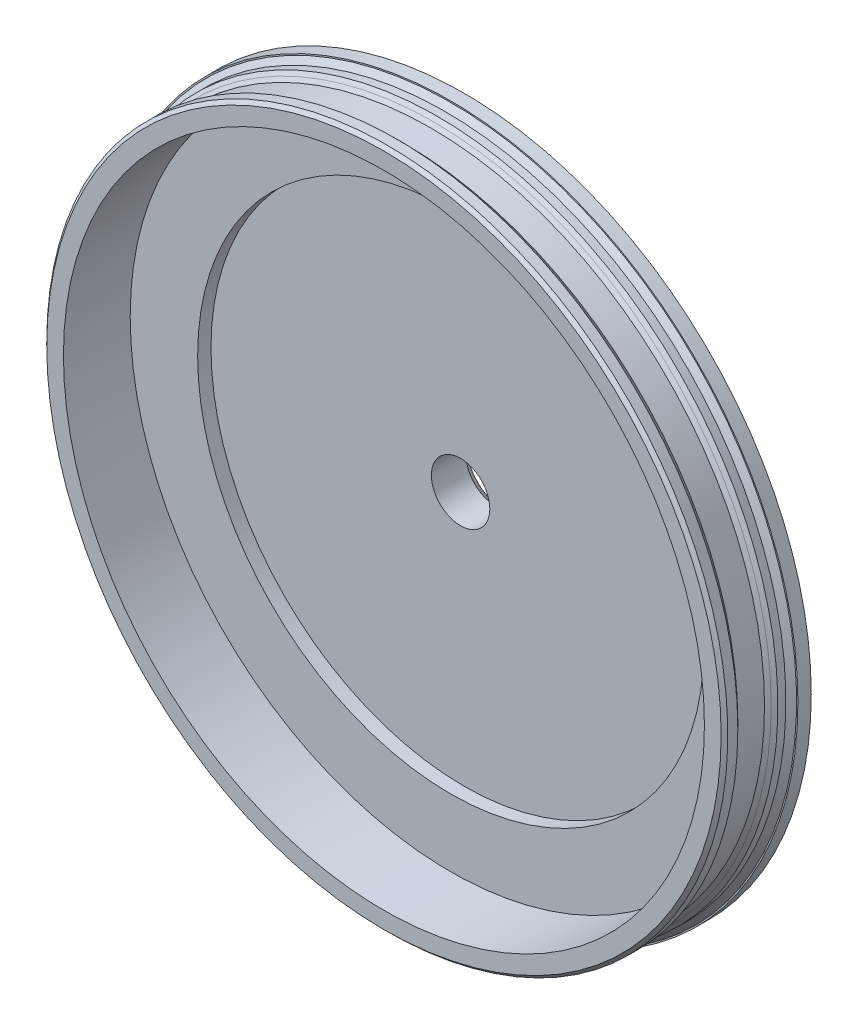
ISO-10303-21;
HEADER;
FILE_DESCRIPTION(('STEP AP214'),'2;1');
FILE_NAME('part.step','',(''),(''),'','','');
FILE_SCHEMA(('AUTOMOTIVE_DESIGN { 1 0 10303 214 1 1 1 1 }'));
ENDSEC;
DATA;
#1=APPLICATION_CONTEXT('core data for automotive mechanical design processes');
#2=APPLICATION_PROTOCOL_DEFINITION('international standard','automotive_design',2000,#1);
#3=PRODUCT_CONTEXT('',#1,'mechanical');
#4=PRODUCT('Part','Part','',(#3));
#5=PRODUCT_RELATED_PRODUCT_CATEGORY('part','',(#4));
#6=PRODUCT_DEFINITION_FORMATION('','',#4);
#7=PRODUCT_DEFINITION_CONTEXT('part definition',#1,'design');
#8=PRODUCT_DEFINITION('design','',#6,#7);
#9=PRODUCT_DEFINITION_SHAPE('','',#8);
#10=(LENGTH_UNIT() NAMED_UNIT(*) SI_UNIT(.MILLI.,.METRE.));
#11=(NAMED_UNIT(*) PLANE_ANGLE_UNIT() SI_UNIT($,.RADIAN.));
#12=(NAMED_UNIT(*) SI_UNIT($,.STERADIAN.) SOLID_ANGLE_UNIT());
#13=UNCERTAINTY_MEASURE_WITH_UNIT(LENGTH_MEASURE(1.E-05),#10,'distance_accuracy_value','');
#14=(GEOMETRIC_REPRESENTATION_CONTEXT(3) GLOBAL_UNCERTAINTY_ASSIGNED_CONTEXT((#13)) GLOBAL_UNIT_ASSIGNED_CONTEXT((#10,
#11,#12)) REPRESENTATION_CONTEXT('',''));
#15=CARTESIAN_POINT('',(0.,0.,0.));
#16=DIRECTION('',(0.,0.,1.));
#17=DIRECTION('',(1.,0.,0.));
#18=AXIS2_PLACEMENT_3D('',#15,#16,#17);
#19=CARTESIAN_POINT('',(0.,0.,-73.9813673678491));
#20=DIRECTION('',(0.,0.,-1.));
#21=DIRECTION('',(-1.,0.,0.));
#22=AXIS2_PLACEMENT_3D('',#19,#20,#21);
#23=CYLINDRICAL_SURFACE('',#22,37.9);
#24=CARTESIAN_POINT('',(0.,0.,8.7));
#25=DIRECTION('',(0.,0.,-1.));
#26=DIRECTION('',(-1.,0.,0.));
#27=AXIS2_PLACEMENT_3D('',#24,#25,#26);
#28=CIRCLE('',#27,37.9);
#29=CARTESIAN_POINT('',(-37.9,0.,8.7));
#30=VERTEX_POINT('',#29);
#31=EDGE_CURVE('E85',#30,#30,#28,.T.);
#32=ORIENTED_EDGE('',*,*,#31,.F.);
#33=EDGE_LOOP('',(#32));
#34=FACE_BOUND('',#33,.T.);
#35=CARTESIAN_POINT('',(0.,0.,6.7));
#36=DIRECTION('',(0.,0.,-1.));
#37=DIRECTION('',(-1.,0.,0.));
#38=AXIS2_PLACEMENT_3D('',#35,#36,#37);
#39=CIRCLE('',#38,37.9);
#40=CARTESIAN_POINT('',(-37.9,0.,6.7));
#41=VERTEX_POINT('',#40);
#42=EDGE_CURVE('E44',#41,#41,#39,.F.);
#43=ORIENTED_EDGE('',*,*,#42,.F.);
#44=EDGE_LOOP('',(#43));
#45=FACE_BOUND('',#44,.T.);
#46=ADVANCED_FACE('F33',(#34,#45),#23,.F.);
#47=CARTESIAN_POINT('',(37.9,0.,8.7));
#48=DIRECTION('',(0.,0.,-1.));
#49=DIRECTION('',(-1.,0.,0.));
#50=AXIS2_PLACEMENT_3D('',#47,#48,#49);
#51=PLANE('',#50);
#52=CARTESIAN_POINT('',(0.,0.,8.7));
#53=DIRECTION('',(0.,0.,-1.));
#54=DIRECTION('',(-1.,0.,0.));
#55=AXIS2_PLACEMENT_3D('',#52,#53,#54);
#56=CIRCLE('',#55,48.);
#57=CARTESIAN_POINT('',(-48.,0.,8.7));
#58=VERTEX_POINT('',#57);
#59=EDGE_CURVE('E88',#58,#58,#56,.T.);
#60=ORIENTED_EDGE('',*,*,#59,.F.);
#61=EDGE_LOOP('',(#60));
#62=FACE_BOUND('',#61,.T.);
#63=ORIENTED_EDGE('',*,*,#31,.T.);
#64=EDGE_LOOP('',(#63));
#65=FACE_BOUND('',#64,.T.);
#66=ADVANCED_FACE('F122',(#62,#65),#51,.F.);
#67=CARTESIAN_POINT('',(0.,0.,-73.9813673678491));
#68=DIRECTION('',(0.,0.,-1.));
#69=DIRECTION('',(-1.,0.,0.));
#70=AXIS2_PLACEMENT_3D('',#67,#68,#69);
#71=CYLINDRICAL_SURFACE('',#70,48.);
#72=CARTESIAN_POINT('',(0.,0.,18.7));
#73=DIRECTION('',(0.,0.,-1.));
#74=DIRECTION('',(-1.,0.,0.));
#75=AXIS2_PLACEMENT_3D('',#72,#73,#74);
#76=CIRCLE('',#75,48.);
#77=CARTESIAN_POINT('',(-48.,0.,18.7));
#78=VERTEX_POINT('',#77);
#79=EDGE_CURVE('E91',#78,#78,#76,.T.);
#80=ORIENTED_EDGE('',*,*,#79,.F.);
#81=EDGE_LOOP('',(#80));
#82=FACE_BOUND('',#81,.T.);
#83=ORIENTED_EDGE('',*,*,#59,.T.);
#84=EDGE_LOOP('',(#83));
#85=FACE_BOUND('',#84,.T.);
#86=ADVANCED_FACE('F130',(#82,#85),#71,.F.);
#87=CARTESIAN_POINT('',(48.,0.,18.7));
#88=DIRECTION('',(0.,0.,-1.));
#89=DIRECTION('',(-1.,0.,0.));
#90=AXIS2_PLACEMENT_3D('',#87,#88,#89);
#91=PLANE('',#90);
#92=CARTESIAN_POINT('',(0.,0.,18.7));
#93=DIRECTION('',(0.,0.,-1.));
#94=DIRECTION('',(-1.,0.,0.));
#95=AXIS2_PLACEMENT_3D('',#92,#93,#94);
#96=CIRCLE('',#95,50.5);
#97=CARTESIAN_POINT('',(-50.5,0.,18.7));
#98=VERTEX_POINT('',#97);
#99=EDGE_CURVE('E76',#98,#98,#96,.F.);
#100=ORIENTED_EDGE('',*,*,#99,.T.);
#101=EDGE_LOOP('',(#100));
#102=FACE_BOUND('',#101,.T.);
#103=ORIENTED_EDGE('',*,*,#79,.T.);
#104=EDGE_LOOP('',(#103));
#105=FACE_BOUND('',#104,.T.);
#106=ADVANCED_FACE('F195',(#102,#105),#91,.F.);
#107=CARTESIAN_POINT('',(0.,0.,-73.9813673678491));
#108=DIRECTION('',(0.,0.,-1.));
#109=DIRECTION('',(-1.,0.,0.));
#110=AXIS2_PLACEMENT_3D('',#107,#108,#109);
#111=CYLINDRICAL_SURFACE('',#110,51.);
#112=CARTESIAN_POINT('',(0.,0.,18.2));
#113=DIRECTION('',(0.,0.,-1.));
#114=DIRECTION('',(-1.,0.,0.));
#115=AXIS2_PLACEMENT_3D('',#112,#113,#114);
#116=CIRCLE('',#115,51.);
#117=CARTESIAN_POINT('',(-51.,0.,18.2));
#118=VERTEX_POINT('',#117);
#119=EDGE_CURVE('E79',#118,#118,#116,.T.);
#120=ORIENTED_EDGE('',*,*,#119,.T.);
#121=EDGE_LOOP('',(#120));
#122=FACE_BOUND('',#121,.T.);
#123=CARTESIAN_POINT('',(0.,0.,16.7));
#124=DIRECTION('',(0.,0.,1.));
#125=DIRECTION('',(1.,0.,0.));
#126=AXIS2_PLACEMENT_3D('',#123,#124,#125);
#127=CIRCLE('',#126,51.);
#128=CARTESIAN_POINT('',(51.,0.,16.7));
#129=VERTEX_POINT('',#128);
#130=EDGE_CURVE('E82',#129,#129,#127,.T.);
#131=ORIENTED_EDGE('',*,*,#130,.T.);
#132=EDGE_LOOP('',(#131));
#133=FACE_BOUND('',#132,.T.);
#134=ADVANCED_FACE('F191',(#122,#133),#111,.T.);
#135=CARTESIAN_POINT('',(0.,0.,-73.9813673678491));
#136=DIRECTION('',(0.,0.,-1.));
#137=DIRECTION('',(-1.,0.,0.));
#138=AXIS2_PLACEMENT_3D('',#135,#136,#137);
#139=CYLINDRICAL_SURFACE('',#138,50.);
#140=CARTESIAN_POINT('',(0.,0.,11.7));
#141=DIRECTION('',(0.,0.,-1.));
#142=DIRECTION('',(-1.,0.,0.));
#143=AXIS2_PLACEMENT_3D('',#140,#141,#142);
#144=CIRCLE('',#143,50.);
#145=CARTESIAN_POINT('',(-50.,0.,11.7));
#146=VERTEX_POINT('',#145);
#147=EDGE_CURVE('E59',#146,#146,#144,.F.);
#148=ORIENTED_EDGE('',*,*,#147,.T.);
#149=EDGE_LOOP('',(#148));
#150=FACE_BOUND('',#149,.T.);
#151=CARTESIAN_POINT('',(0.,0.,15.7));
#152=DIRECTION('',(0.,0.,1.));
#153=DIRECTION('',(1.,0.,0.));
#154=AXIS2_PLACEMENT_3D('',#151,#152,#153);
#155=CIRCLE('',#154,50.);
#156=CARTESIAN_POINT('',(50.,0.,15.7));
#157=VERTEX_POINT('',#156);
#158=EDGE_CURVE('E70',#157,#157,#155,.F.);
#159=ORIENTED_EDGE('',*,*,#158,.T.);
#160=EDGE_LOOP('',(#159));
#161=FACE_BOUND('',#160,.T.);
#162=ADVANCED_FACE('F187',(#150,#161),#139,.T.);
#163=CARTESIAN_POINT('',(0.,0.,-73.9813673678491));
#164=DIRECTION('',(0.,0.,-1.));
#165=DIRECTION('',(-1.,0.,0.));
#166=AXIS2_PLACEMENT_3D('',#163,#164,#165);
#167=CYLINDRICAL_SURFACE('',#166,51.);
#168=CARTESIAN_POINT('',(0.,0.,9.49999999999998));
#169=DIRECTION('',(0.,0.,-1.));
#170=DIRECTION('',(-1.,0.,0.));
#171=AXIS2_PLACEMENT_3D('',#168,#169,#170);
#172=CIRCLE('',#171,51.);
#173=CARTESIAN_POINT('',(-51.,0.,9.49999999999998));
#174=VERTEX_POINT('',#173);
#175=EDGE_CURVE('E53',#174,#174,#172,.F.);
#176=ORIENTED_EDGE('',*,*,#175,.T.);
#177=EDGE_LOOP('',(#176));
#178=FACE_BOUND('',#177,.T.);
#179=CARTESIAN_POINT('',(0.,0.,10.7));
#180=DIRECTION('',(0.,0.,-1.));
#181=DIRECTION('',(-1.,0.,0.));
#182=AXIS2_PLACEMENT_3D('',#179,#180,#181);
#183=CIRCLE('',#182,51.);
#184=CARTESIAN_POINT('',(-51.,0.,10.7));
#185=VERTEX_POINT('',#184);
#186=EDGE_CURVE('E73',#185,#185,#183,.T.);
#187=ORIENTED_EDGE('',*,*,#186,.T.);
#188=EDGE_LOOP('',(#187));
#189=FACE_BOUND('',#188,.T.);
#190=ADVANCED_FACE('F172',(#178,#189),#167,.T.);
#191=CARTESIAN_POINT('',(51.,0.,8.7));
#192=DIRECTION('',(0.,0.,-1.));
#193=DIRECTION('',(-1.,0.,0.));
#194=AXIS2_PLACEMENT_3D('',#191,#192,#193);
#195=PLANE('',#194);
#196=CARTESIAN_POINT('',(0.,0.,8.7));
#197=DIRECTION('',(0.,0.,-1.));
#198=DIRECTION('',(-1.,0.,0.));
#199=AXIS2_PLACEMENT_3D('',#196,#197,#198);
#200=CIRCLE('',#199,51.8);
#201=CARTESIAN_POINT('',(-51.8,0.,8.7));
#202=VERTEX_POINT('',#201);
#203=EDGE_CURVE('E56',#202,#202,#200,.T.);
#204=ORIENTED_EDGE('',*,*,#203,.T.);
#205=EDGE_LOOP('',(#204));
#206=FACE_BOUND('',#205,.T.);
#207=CARTESIAN_POINT('',(0.,0.,8.7));
#208=DIRECTION('',(0.,0.,-1.));
#209=DIRECTION('',(-1.,0.,0.));
#210=AXIS2_PLACEMENT_3D('',#207,#208,#209);
#211=CIRCLE('',#210,52.);
#212=CARTESIAN_POINT('',(-52.,0.,8.7));
#213=VERTEX_POINT('',#212);
#214=EDGE_CURVE('E94',#213,#213,#211,.T.);
#215=ORIENTED_EDGE('',*,*,#214,.F.);
#216=EDGE_LOOP('',(#215));
#217=FACE_BOUND('',#216,.T.);
#218=ADVANCED_FACE('F168',(#206,#217),#195,.F.);
#219=CARTESIAN_POINT('',(0.,0.,-73.9813673678491));
#220=DIRECTION('',(0.,0.,-1.));
#221=DIRECTION('',(-1.,0.,0.));
#222=AXIS2_PLACEMENT_3D('',#219,#220,#221);
#223=CYLINDRICAL_SURFACE('',#222,52.);
#224=CARTESIAN_POINT('',(0.,0.,6.7));
#225=DIRECTION('',(0.,0.,-1.));
#226=DIRECTION('',(-1.,0.,0.));
#227=AXIS2_PLACEMENT_3D('',#224,#225,#226);
#228=CIRCLE('',#227,52.);
#229=CARTESIAN_POINT('',(-52.,0.,6.7));
#230=VERTEX_POINT('',#229);
#231=EDGE_CURVE('E67',#230,#230,#228,.T.);
#232=ORIENTED_EDGE('',*,*,#231,.F.);
#233=EDGE_LOOP('',(#232));
#234=FACE_BOUND('',#233,.T.);
#235=ORIENTED_EDGE('',*,*,#214,.T.);
#236=EDGE_LOOP('',(#235));
#237=FACE_BOUND('',#236,.T.);
#238=ADVANCED_FACE('F171',(#234,#237),#223,.T.);
#239=CARTESIAN_POINT('',(52.,0.,6.7));
#240=DIRECTION('',(0.,0.,1.));
#241=DIRECTION('',(1.,0.,0.));
#242=AXIS2_PLACEMENT_3D('',#239,#240,#241);
#243=PLANE('',#242);
#244=CARTESIAN_POINT('',(-0.518258265273894,0.,6.7));
#245=DIRECTION('',(0.,0.,1.));
#246=DIRECTION('',(1.,0.,0.));
#247=AXIS2_PLACEMENT_3D('',#244,#245,#246);
#248=CIRCLE('',#247,40.4182582652739);
#249=CARTESIAN_POINT('',(39.9,0.,6.7));
#250=VERTEX_POINT('',#249);
#251=EDGE_CURVE('E48',#250,#250,#248,.F.);
#252=ORIENTED_EDGE('',*,*,#251,.F.);
#253=EDGE_LOOP('',(#252));
#254=FACE_BOUND('',#253,.T.);
#255=ORIENTED_EDGE('',*,*,#231,.T.);
#256=EDGE_LOOP('',(#255));
#257=FACE_BOUND('',#256,.T.);
#258=ADVANCED_FACE('F141',(#254,#257),#243,.F.);
#259=CARTESIAN_POINT('',(0.,0.,18.2));
#260=DIRECTION('',(0.,0.,-1.));
#261=DIRECTION('',(-1.,0.,0.));
#262=AXIS2_PLACEMENT_3D('',#259,#260,#261);
#263=CONICAL_SURFACE('',#262,51.,0.785398163397469);
#264=ORIENTED_EDGE('',*,*,#99,.F.);
#265=EDGE_LOOP('',(#264));
#266=FACE_BOUND('',#265,.T.);
#267=ORIENTED_EDGE('',*,*,#119,.F.);
#268=EDGE_LOOP('',(#267));
#269=FACE_BOUND('',#268,.T.);
#270=ADVANCED_FACE('F137',(#266,#269),#263,.T.);
#271=CARTESIAN_POINT('',(0.,0.,11.2));
#272=DIRECTION('',(0.,0.,-1.));
#273=DIRECTION('',(-1.,0.,0.));
#274=AXIS2_PLACEMENT_3D('',#271,#272,#273);
#275=CONICAL_SURFACE('',#274,50.5,0.785398163397448);
#276=ORIENTED_EDGE('',*,*,#147,.F.);
#277=EDGE_LOOP('',(#276));
#278=FACE_BOUND('',#277,.T.);
#279=CARTESIAN_POINT('',(0.,0.,11.2));
#280=DIRECTION('',(0.,0.,-1.));
#281=DIRECTION('',(-1.,0.,0.));
#282=AXIS2_PLACEMENT_3D('',#279,#280,#281);
#283=CIRCLE('',#282,50.5);
#284=CARTESIAN_POINT('',(-50.5,0.,11.2));
#285=VERTEX_POINT('',#284);
#286=EDGE_CURVE('E63',#285,#285,#283,.T.);
#287=ORIENTED_EDGE('',*,*,#286,.F.);
#288=EDGE_LOOP('',(#287));
#289=FACE_BOUND('',#288,.T.);
#290=ADVANCED_FACE('F140',(#278,#289),#275,.T.);
#291=CARTESIAN_POINT('',(0.,0.,10.7));
#292=DIRECTION('',(0.,0.,-1.));
#293=DIRECTION('',(-1.,0.,0.));
#294=AXIS2_PLACEMENT_3D('',#291,#292,#293);
#295=CONICAL_SURFACE('',#294,51.,0.785398163397455);
#296=ORIENTED_EDGE('',*,*,#286,.T.);
#297=EDGE_LOOP('',(#296));
#298=FACE_BOUND('',#297,.T.);
#299=ORIENTED_EDGE('',*,*,#186,.F.);
#300=EDGE_LOOP('',(#299));
#301=FACE_BOUND('',#300,.T.);
#302=ADVANCED_FACE('F143',(#298,#301),#295,.T.);
#303=CARTESIAN_POINT('',(0.,0.,16.2));
#304=DIRECTION('',(0.,0.,1.));
#305=DIRECTION('',(1.,0.,0.));
#306=AXIS2_PLACEMENT_3D('',#303,#304,#305);
#307=CONICAL_SURFACE('',#306,50.5,0.785398163397428);
#308=ORIENTED_EDGE('',*,*,#130,.F.);
#309=EDGE_LOOP('',(#308));
#310=FACE_BOUND('',#309,.T.);
#311=CARTESIAN_POINT('',(0.,0.,16.2));
#312=DIRECTION('',(0.,0.,1.));
#313=DIRECTION('',(1.,0.,0.));
#314=AXIS2_PLACEMENT_3D('',#311,#312,#313);
#315=CIRCLE('',#314,50.5);
#316=CARTESIAN_POINT('',(50.5,0.,16.2));
#317=VERTEX_POINT('',#316);
#318=EDGE_CURVE('E60',#317,#317,#315,.F.);
#319=ORIENTED_EDGE('',*,*,#318,.F.);
#320=EDGE_LOOP('',(#319));
#321=FACE_BOUND('',#320,.T.);
#322=ADVANCED_FACE('F146',(#310,#321),#307,.T.);
#323=CARTESIAN_POINT('',(0.,0.,15.7));
#324=DIRECTION('',(0.,0.,1.));
#325=DIRECTION('',(1.,0.,0.));
#326=AXIS2_PLACEMENT_3D('',#323,#324,#325);
#327=CONICAL_SURFACE('',#326,50.,0.785398163397448);
#328=ORIENTED_EDGE('',*,*,#318,.T.);
#329=EDGE_LOOP('',(#328));
#330=FACE_BOUND('',#329,.T.);
#331=ORIENTED_EDGE('',*,*,#158,.F.);
#332=EDGE_LOOP('',(#331));
#333=FACE_BOUND('',#332,.T.);
#334=ADVANCED_FACE('F151',(#330,#333),#327,.T.);
#335=CARTESIAN_POINT('',(0.,0.,8.7));
#336=DIRECTION('',(0.,0.,-1.));
#337=DIRECTION('',(-1.,0.,0.));
#338=AXIS2_PLACEMENT_3D('',#335,#336,#337);
#339=CONICAL_SURFACE('',#338,51.8,0.785398163397453);
#340=ORIENTED_EDGE('',*,*,#175,.F.);
#341=EDGE_LOOP('',(#340));
#342=FACE_BOUND('',#341,.T.);
#343=ORIENTED_EDGE('',*,*,#203,.F.);
#344=EDGE_LOOP('',(#343));
#345=FACE_BOUND('',#344,.T.);
#346=ADVANCED_FACE('F154',(#342,#345),#339,.T.);
#347=CARTESIAN_POINT('',(-0.518258265273894,0.,-114.320098012498));
#348=DIRECTION('',(0.,0.,1.));
#349=DIRECTION('',(1.,0.,0.));
#350=AXIS2_PLACEMENT_3D('',#347,#348,#349);
#351=CYLINDRICAL_SURFACE('',#350,40.4182582652739);
#352=ORIENTED_EDGE('',*,*,#251,.T.);
#353=EDGE_LOOP('',(#352));
#354=FACE_BOUND('',#353,.T.);
#355=CARTESIAN_POINT('',(-0.518258265273894,0.,0.));
#356=DIRECTION('',(0.,0.,1.));
#357=DIRECTION('',(1.,0.,0.));
#358=AXIS2_PLACEMENT_3D('',#355,#356,#357);
#359=CIRCLE('',#358,40.4182582652739);
#360=CARTESIAN_POINT('',(39.9,0.,0.));
#361=VERTEX_POINT('',#360);
#362=EDGE_CURVE('E64',#361,#361,#359,.T.);
#363=ORIENTED_EDGE('',*,*,#362,.T.);
#364=EDGE_LOOP('',(#363));
#365=FACE_BOUND('',#364,.T.);
#366=ADVANCED_FACE('F116',(#354,#365),#351,.T.);
#367=CARTESIAN_POINT('',(-0.518258265273894,0.,6.7));
#368=DIRECTION('',(0.,0.,-1.));
#369=DIRECTION('',(-1.,0.,0.));
#370=AXIS2_PLACEMENT_3D('',#367,#368,#369);
#371=PLANE('',#370);
#372=ORIENTED_EDGE('',*,*,#42,.T.);
#373=EDGE_LOOP('',(#372));
#374=FACE_BOUND('',#373,.T.);
#375=CARTESIAN_POINT('',(-0.518258265273894,0.,6.7));
#376=DIRECTION('',(0.,0.,-1.));
#377=DIRECTION('',(-1.,0.,0.));
#378=AXIS2_PLACEMENT_3D('',#375,#376,#377);
#379=CIRCLE('',#378,4.375);
#380=CARTESIAN_POINT('',(-4.89325826527389,0.,6.7));
#381=VERTEX_POINT('',#380);
#382=EDGE_CURVE('E101',#381,#381,#379,.T.);
#383=ORIENTED_EDGE('',*,*,#382,.T.);
#384=EDGE_LOOP('',(#383));
#385=FACE_BOUND('',#384,.T.);
#386=ADVANCED_FACE('F105',(#374,#385),#371,.F.);
#387=CARTESIAN_POINT('',(-0.518258265273894,0.,-114.320098012498));
#388=DIRECTION('',(0.,0.,1.));
#389=DIRECTION('',(1.,0.,0.));
#390=AXIS2_PLACEMENT_3D('',#387,#388,#389);
#391=CYLINDRICAL_SURFACE('',#390,4.375);
#392=CARTESIAN_POINT('',(-0.518258265273894,0.,1.5));
#393=DIRECTION('',(0.,0.,1.));
#394=DIRECTION('',(1.,0.,0.));
#395=AXIS2_PLACEMENT_3D('',#392,#393,#394);
#396=CIRCLE('',#395,4.375);
#397=CARTESIAN_POINT('',(3.85674173472611,0.,1.5));
#398=VERTEX_POINT('',#397);
#399=EDGE_CURVE('E10',#398,#398,#396,.F.);
#400=ORIENTED_EDGE('',*,*,#399,.T.);
#401=EDGE_LOOP('',(#400));
#402=FACE_BOUND('',#401,.T.);
#403=ORIENTED_EDGE('',*,*,#382,.F.);
#404=EDGE_LOOP('',(#403));
#405=FACE_BOUND('',#404,.T.);
#406=ADVANCED_FACE('F107',(#402,#405),#391,.F.);
#407=CARTESIAN_POINT('',(39.9,0.,0.));
#408=DIRECTION('',(0.,0.,1.));
#409=DIRECTION('',(1.,0.,0.));
#410=AXIS2_PLACEMENT_3D('',#407,#408,#409);
#411=PLANE('',#410);
#412=CARTESIAN_POINT('',(-0.518258265273894,0.,0.));
#413=DIRECTION('',(0.,0.,1.));
#414=DIRECTION('',(1.,0.,0.));
#415=AXIS2_PLACEMENT_3D('',#412,#413,#414);
#416=CIRCLE('',#415,5.87500000000001);
#417=CARTESIAN_POINT('',(5.35674173472611,0.,0.));
#418=VERTEX_POINT('',#417);
#419=EDGE_CURVE('E40',#418,#418,#416,.T.);
#420=ORIENTED_EDGE('',*,*,#419,.T.);
#421=EDGE_LOOP('',(#420));
#422=FACE_BOUND('',#421,.T.);
#423=ORIENTED_EDGE('',*,*,#362,.F.);
#424=EDGE_LOOP('',(#423));
#425=FACE_BOUND('',#424,.T.);
#426=ADVANCED_FACE('F109',(#422,#425),#411,.F.);
#427=CARTESIAN_POINT('',(-0.518258265273894,0.,0.));
#428=DIRECTION('',(0.,0.,-1.));
#429=DIRECTION('',(-1.,0.,0.));
#430=AXIS2_PLACEMENT_3D('',#427,#428,#429);
#431=CONICAL_SURFACE('',#430,5.87500000000001,0.785398163397449);
#432=ORIENTED_EDGE('',*,*,#399,.F.);
#433=EDGE_LOOP('',(#432));
#434=FACE_BOUND('',#433,.T.);
#435=ORIENTED_EDGE('',*,*,#419,.F.);
#436=EDGE_LOOP('',(#435));
#437=FACE_BOUND('',#436,.T.);
#438=ADVANCED_FACE('F35',(#434,#437),#431,.F.);
#439=CLOSED_SHELL('',(#46,#66,#86,#106,#134,#162,#190,#218,#238,#258,#270,#290,#302,#322,#334,
#346,#366,#386,#406,#426,#438));
#440=MANIFOLD_SOLID_BREP('B2',#439);
#441=ADVANCED_BREP_SHAPE_REPRESENTATION('',(#18,#440),#14);
#442=SHAPE_DEFINITION_REPRESENTATION(#9,#441);
ENDSEC;
END-ISO-10303-21;
